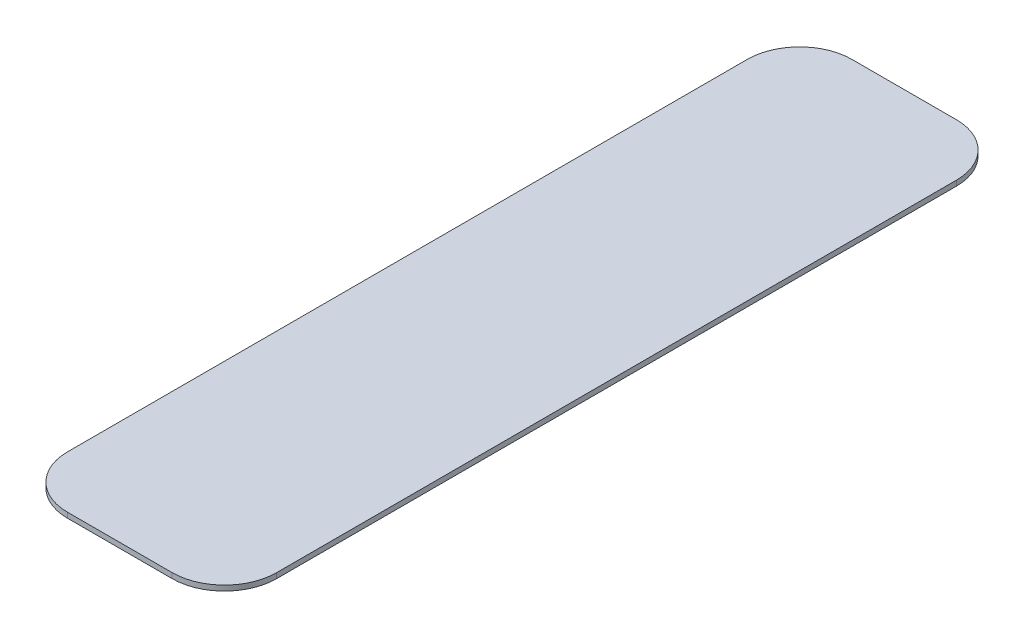
ISO-10303-21;
HEADER;
FILE_DESCRIPTION(('STEP AP214'),'2;1');
FILE_NAME('part.step','',(''),(''),'','','');
FILE_SCHEMA(('AUTOMOTIVE_DESIGN { 1 0 10303 214 1 1 1 1 }'));
ENDSEC;
DATA;
#1=APPLICATION_CONTEXT('core data for automotive mechanical design processes');
#2=APPLICATION_PROTOCOL_DEFINITION('international standard','automotive_design',2000,#1);
#3=PRODUCT_CONTEXT('',#1,'mechanical');
#4=PRODUCT('Part','Part','',(#3));
#5=PRODUCT_RELATED_PRODUCT_CATEGORY('part','',(#4));
#6=PRODUCT_DEFINITION_FORMATION('','',#4);
#7=PRODUCT_DEFINITION_CONTEXT('part definition',#1,'design');
#8=PRODUCT_DEFINITION('design','',#6,#7);
#9=PRODUCT_DEFINITION_SHAPE('','',#8);
#10=(LENGTH_UNIT() NAMED_UNIT(*) SI_UNIT(.MILLI.,.METRE.));
#11=(NAMED_UNIT(*) PLANE_ANGLE_UNIT() SI_UNIT($,.RADIAN.));
#12=(NAMED_UNIT(*) SI_UNIT($,.STERADIAN.) SOLID_ANGLE_UNIT());
#13=UNCERTAINTY_MEASURE_WITH_UNIT(LENGTH_MEASURE(1.E-05),#10,'distance_accuracy_value','');
#14=(GEOMETRIC_REPRESENTATION_CONTEXT(3) GLOBAL_UNCERTAINTY_ASSIGNED_CONTEXT((#13)) GLOBAL_UNIT_ASSIGNED_CONTEXT((#10,
#11,#12)) REPRESENTATION_CONTEXT('',''));
#15=CARTESIAN_POINT('',(0.,0.,0.));
#16=DIRECTION('',(0.,0.,1.));
#17=DIRECTION('',(1.,0.,0.));
#18=AXIS2_PLACEMENT_3D('',#15,#16,#17);
#19=CARTESIAN_POINT('',(-4.00000000000001,0.0999999999999998,15.));
#20=DIRECTION('',(1.,0.,0.));
#21=DIRECTION('',(0.,0.,-1.));
#22=AXIS2_PLACEMENT_3D('',#19,#20,#21);
#23=PLANE('',#22);
#24=DIRECTION('',(0.,0.,-1.));
#25=VECTOR('',#24,1.);
#26=CARTESIAN_POINT('',(-4.00000000000001,0.0999999999999998,15.));
#27=LINE('',#26,#25);
#28=CARTESIAN_POINT('',(-4.00000000000001,0.0999999999999998,13.));
#29=VERTEX_POINT('',#28);
#30=CARTESIAN_POINT('',(-4.00000000000001,0.0999999999999998,-13.));
#31=VERTEX_POINT('',#30);
#32=EDGE_CURVE('E129',#29,#31,#27,.T.);
#33=ORIENTED_EDGE('',*,*,#32,.T.);
#34=DIRECTION('',(0.,-1.,0.));
#35=VECTOR('',#34,1.);
#36=CARTESIAN_POINT('',(-4.00000000000001,0.0999999999999998,-13.));
#37=LINE('',#36,#35);
#38=CARTESIAN_POINT('',(-4.00000000000001,-0.0999999999999998,-13.));
#39=VERTEX_POINT('',#38);
#40=EDGE_CURVE('E168',#31,#39,#37,.T.);
#41=ORIENTED_EDGE('',*,*,#40,.T.);
#42=DIRECTION('',(0.,0.,-1.));
#43=VECTOR('',#42,1.);
#44=CARTESIAN_POINT('',(-4.00000000000001,-0.0999999999999998,15.));
#45=LINE('',#44,#43);
#46=CARTESIAN_POINT('',(-4.00000000000001,-0.0999999999999998,13.));
#47=VERTEX_POINT('',#46);
#48=EDGE_CURVE('E134',#47,#39,#45,.T.);
#49=ORIENTED_EDGE('',*,*,#48,.F.);
#50=DIRECTION('',(0.,-1.,0.));
#51=VECTOR('',#50,1.);
#52=CARTESIAN_POINT('',(-4.00000000000001,0.0999999999999998,13.));
#53=LINE('',#52,#51);
#54=EDGE_CURVE('E165',#47,#29,#53,.F.);
#55=ORIENTED_EDGE('',*,*,#54,.T.);
#56=EDGE_LOOP('',(#33,#41,#49,#55));
#57=FACE_BOUND('',#56,.T.);
#58=ADVANCED_FACE('F38',(#57),#23,.F.);
#59=CARTESIAN_POINT('',(-4.00000000000001,-0.0999999999999998,15.));
#60=DIRECTION('',(0.,1.,0.));
#61=DIRECTION('',(0.,0.,1.));
#62=AXIS2_PLACEMENT_3D('',#59,#60,#61);
#63=PLANE('',#62);
#64=DIRECTION('',(1.,0.,0.));
#65=VECTOR('',#64,1.);
#66=CARTESIAN_POINT('',(-4.00000000000001,-0.0999999999999998,-15.));
#67=LINE('',#66,#65);
#68=CARTESIAN_POINT('',(-2.00000000000001,-0.0999999999999998,-15.));
#69=VERTEX_POINT('',#68);
#70=CARTESIAN_POINT('',(1.99999999999999,-0.0999999999999998,-15.));
#71=VERTEX_POINT('',#70);
#72=EDGE_CURVE('E183',#69,#71,#67,.T.);
#73=ORIENTED_EDGE('',*,*,#72,.T.);
#74=CARTESIAN_POINT('',(1.99999999999999,-0.0999999999999998,-13.));
#75=DIRECTION('',(0.,1.,0.));
#76=DIRECTION('',(0.,0.,1.));
#77=AXIS2_PLACEMENT_3D('',#74,#75,#76);
#78=CIRCLE('',#77,2.);
#79=CARTESIAN_POINT('',(3.99999999999999,-0.0999999999999998,-13.));
#80=VERTEX_POINT('',#79);
#81=EDGE_CURVE('E162',#71,#80,#78,.F.);
#82=ORIENTED_EDGE('',*,*,#81,.T.);
#83=DIRECTION('',(0.,0.,-1.));
#84=VECTOR('',#83,1.);
#85=CARTESIAN_POINT('',(3.99999999999999,-0.0999999999999998,15.));
#86=LINE('',#85,#84);
#87=CARTESIAN_POINT('',(3.99999999999999,-0.0999999999999998,13.));
#88=VERTEX_POINT('',#87);
#89=EDGE_CURVE('E128',#88,#80,#86,.T.);
#90=ORIENTED_EDGE('',*,*,#89,.F.);
#91=CARTESIAN_POINT('',(1.99999999999999,-0.0999999999999998,13.));
#92=DIRECTION('',(0.,1.,0.));
#93=DIRECTION('',(0.,0.,1.));
#94=AXIS2_PLACEMENT_3D('',#91,#92,#93);
#95=CIRCLE('',#94,2.);
#96=CARTESIAN_POINT('',(1.99999999999999,-0.0999999999999998,15.));
#97=VERTEX_POINT('',#96);
#98=EDGE_CURVE('E132',#88,#97,#95,.F.);
#99=ORIENTED_EDGE('',*,*,#98,.T.);
#100=DIRECTION('',(1.,0.,0.));
#101=VECTOR('',#100,1.);
#102=CARTESIAN_POINT('',(-4.00000000000001,-0.0999999999999998,15.));
#103=LINE('',#102,#101);
#104=CARTESIAN_POINT('',(-2.00000000000001,-0.0999999999999998,15.));
#105=VERTEX_POINT('',#104);
#106=EDGE_CURVE('E175',#105,#97,#103,.T.);
#107=ORIENTED_EDGE('',*,*,#106,.F.);
#108=CARTESIAN_POINT('',(-2.00000000000001,-0.0999999999999998,13.));
#109=DIRECTION('',(0.,1.,0.));
#110=DIRECTION('',(0.,0.,1.));
#111=AXIS2_PLACEMENT_3D('',#108,#109,#110);
#112=CIRCLE('',#111,2.);
#113=EDGE_CURVE('E62',#105,#47,#112,.F.);
#114=ORIENTED_EDGE('',*,*,#113,.T.);
#115=ORIENTED_EDGE('',*,*,#48,.T.);
#116=CARTESIAN_POINT('',(-2.00000000000001,-0.0999999999999998,-13.));
#117=DIRECTION('',(0.,1.,0.));
#118=DIRECTION('',(0.,0.,1.));
#119=AXIS2_PLACEMENT_3D('',#116,#117,#118);
#120=CIRCLE('',#119,2.);
#121=EDGE_CURVE('E54',#39,#69,#120,.F.);
#122=ORIENTED_EDGE('',*,*,#121,.T.);
#123=EDGE_LOOP('',(#73,#82,#90,#99,#107,#114,#115,#122));
#124=FACE_BOUND('',#123,.T.);
#125=ADVANCED_FACE('F215',(#124),#63,.F.);
#126=CARTESIAN_POINT('',(3.99999999999999,0.0999999999999998,15.));
#127=DIRECTION('',(-1.,0.,0.));
#128=DIRECTION('',(0.,-1.,0.));
#129=AXIS2_PLACEMENT_3D('',#126,#127,#128);
#130=PLANE('',#129);
#131=ORIENTED_EDGE('',*,*,#89,.T.);
#132=DIRECTION('',(0.,1.,0.));
#133=VECTOR('',#132,1.);
#134=CARTESIAN_POINT('',(3.99999999999999,0.0999999999999998,-13.));
#135=LINE('',#134,#133);
#136=CARTESIAN_POINT('',(3.99999999999999,0.0999999999999998,-13.));
#137=VERTEX_POINT('',#136);
#138=EDGE_CURVE('E118',#80,#137,#135,.T.);
#139=ORIENTED_EDGE('',*,*,#138,.T.);
#140=DIRECTION('',(0.,0.,-1.));
#141=VECTOR('',#140,1.);
#142=CARTESIAN_POINT('',(3.99999999999999,0.0999999999999998,15.));
#143=LINE('',#142,#141);
#144=CARTESIAN_POINT('',(3.99999999999999,0.0999999999999998,13.));
#145=VERTEX_POINT('',#144);
#146=EDGE_CURVE('E109',#145,#137,#143,.T.);
#147=ORIENTED_EDGE('',*,*,#146,.F.);
#148=DIRECTION('',(0.,1.,0.));
#149=VECTOR('',#148,1.);
#150=CARTESIAN_POINT('',(3.99999999999999,-0.0999999999999998,13.));
#151=LINE('',#150,#149);
#152=EDGE_CURVE('E124',#145,#88,#151,.F.);
#153=ORIENTED_EDGE('',*,*,#152,.T.);
#154=EDGE_LOOP('',(#131,#139,#147,#153));
#155=FACE_BOUND('',#154,.T.);
#156=ADVANCED_FACE('F123',(#155),#130,.F.);
#157=CARTESIAN_POINT('',(-4.00000000000001,0.0999999999999998,15.));
#158=DIRECTION('',(0.,-1.,0.));
#159=DIRECTION('',(0.,0.,-1.));
#160=AXIS2_PLACEMENT_3D('',#157,#158,#159);
#161=PLANE('',#160);
#162=ORIENTED_EDGE('',*,*,#146,.T.);
#163=CARTESIAN_POINT('',(1.99999999999999,0.0999999999999998,-13.));
#164=DIRECTION('',(0.,-1.,0.));
#165=DIRECTION('',(0.,0.,-1.));
#166=AXIS2_PLACEMENT_3D('',#163,#164,#165);
#167=CIRCLE('',#166,2.);
#168=CARTESIAN_POINT('',(1.99999999999999,0.0999999999999998,-15.));
#169=VERTEX_POINT('',#168);
#170=EDGE_CURVE('E147',#137,#169,#167,.F.);
#171=ORIENTED_EDGE('',*,*,#170,.T.);
#172=DIRECTION('',(-1.,0.,0.));
#173=VECTOR('',#172,1.);
#174=CARTESIAN_POINT('',(-4.00000000000001,0.0999999999999998,-15.));
#175=LINE('',#174,#173);
#176=CARTESIAN_POINT('',(-2.00000000000001,0.0999999999999998,-15.));
#177=VERTEX_POINT('',#176);
#178=EDGE_CURVE('E177',#169,#177,#175,.T.);
#179=ORIENTED_EDGE('',*,*,#178,.T.);
#180=CARTESIAN_POINT('',(-2.00000000000001,0.0999999999999998,-13.));
#181=DIRECTION('',(0.,-1.,0.));
#182=DIRECTION('',(0.,0.,-1.));
#183=AXIS2_PLACEMENT_3D('',#180,#181,#182);
#184=CIRCLE('',#183,2.);
#185=EDGE_CURVE('E144',#177,#31,#184,.F.);
#186=ORIENTED_EDGE('',*,*,#185,.T.);
#187=ORIENTED_EDGE('',*,*,#32,.F.);
#188=CARTESIAN_POINT('',(-2.00000000000001,0.0999999999999998,13.));
#189=DIRECTION('',(0.,-1.,0.));
#190=DIRECTION('',(0.,0.,-1.));
#191=AXIS2_PLACEMENT_3D('',#188,#189,#190);
#192=CIRCLE('',#191,2.);
#193=CARTESIAN_POINT('',(-2.00000000000001,0.0999999999999998,15.));
#194=VERTEX_POINT('',#193);
#195=EDGE_CURVE('E117',#29,#194,#192,.F.);
#196=ORIENTED_EDGE('',*,*,#195,.T.);
#197=DIRECTION('',(-1.,0.,0.));
#198=VECTOR('',#197,1.);
#199=CARTESIAN_POINT('',(-4.00000000000001,0.0999999999999998,15.));
#200=LINE('',#199,#198);
#201=CARTESIAN_POINT('',(1.99999999999999,0.0999999999999998,15.));
#202=VERTEX_POINT('',#201);
#203=EDGE_CURVE('E111',#202,#194,#200,.T.);
#204=ORIENTED_EDGE('',*,*,#203,.F.);
#205=CARTESIAN_POINT('',(1.99999999999999,0.0999999999999998,13.));
#206=DIRECTION('',(0.,-1.,0.));
#207=DIRECTION('',(0.,0.,-1.));
#208=AXIS2_PLACEMENT_3D('',#205,#206,#207);
#209=CIRCLE('',#208,2.);
#210=EDGE_CURVE('E106',#202,#145,#209,.F.);
#211=ORIENTED_EDGE('',*,*,#210,.T.);
#212=EDGE_LOOP('',(#162,#171,#179,#186,#187,#196,#204,#211));
#213=FACE_BOUND('',#212,.T.);
#214=ADVANCED_FACE('F108',(#213),#161,.F.);
#215=CARTESIAN_POINT('',(0.,0.,15.));
#216=DIRECTION('',(0.,0.,1.));
#217=DIRECTION('',(1.,0.,0.));
#218=AXIS2_PLACEMENT_3D('',#215,#216,#217);
#219=PLANE('',#218);
#220=ORIENTED_EDGE('',*,*,#203,.T.);
#221=DIRECTION('',(0.,-1.,0.));
#222=VECTOR('',#221,1.);
#223=CARTESIAN_POINT('',(-2.00000000000001,-0.0999999999999998,15.));
#224=LINE('',#223,#222);
#225=EDGE_CURVE('E11',#194,#105,#224,.T.);
#226=ORIENTED_EDGE('',*,*,#225,.T.);
#227=ORIENTED_EDGE('',*,*,#106,.T.);
#228=DIRECTION('',(0.,1.,0.));
#229=VECTOR('',#228,1.);
#230=CARTESIAN_POINT('',(1.99999999999999,0.0999999999999912,15.));
#231=LINE('',#230,#229);
#232=EDGE_CURVE('E47',#97,#202,#231,.T.);
#233=ORIENTED_EDGE('',*,*,#232,.T.);
#234=EDGE_LOOP('',(#220,#226,#227,#233));
#235=FACE_BOUND('',#234,.T.);
#236=ADVANCED_FACE('F173',(#235),#219,.T.);
#237=CARTESIAN_POINT('',(0.,0.,-15.));
#238=DIRECTION('',(0.,0.,1.));
#239=DIRECTION('',(1.,0.,0.));
#240=AXIS2_PLACEMENT_3D('',#237,#238,#239);
#241=PLANE('',#240);
#242=ORIENTED_EDGE('',*,*,#178,.F.);
#243=DIRECTION('',(0.,1.,0.));
#244=VECTOR('',#243,1.);
#245=CARTESIAN_POINT('',(1.99999999999999,0.,-15.));
#246=LINE('',#245,#244);
#247=EDGE_CURVE('E153',#169,#71,#246,.F.);
#248=ORIENTED_EDGE('',*,*,#247,.T.);
#249=ORIENTED_EDGE('',*,*,#72,.F.);
#250=DIRECTION('',(0.,-1.,0.));
#251=VECTOR('',#250,1.);
#252=CARTESIAN_POINT('',(-2.00000000000001,0.,-15.));
#253=LINE('',#252,#251);
#254=EDGE_CURVE('E150',#69,#177,#253,.F.);
#255=ORIENTED_EDGE('',*,*,#254,.T.);
#256=EDGE_LOOP('',(#242,#248,#249,#255));
#257=FACE_BOUND('',#256,.T.);
#258=ADVANCED_FACE('F199',(#257),#241,.F.);
#259=CARTESIAN_POINT('',(1.99999999999999,0.0999999999999912,-13.));
#260=DIRECTION('',(0.,1.,0.));
#261=DIRECTION('',(-1.,0.,0.));
#262=AXIS2_PLACEMENT_3D('',#259,#260,#261);
#263=CYLINDRICAL_SURFACE('',#262,2.);
#264=ORIENTED_EDGE('',*,*,#81,.F.);
#265=ORIENTED_EDGE('',*,*,#247,.F.);
#266=ORIENTED_EDGE('',*,*,#170,.F.);
#267=ORIENTED_EDGE('',*,*,#138,.F.);
#268=EDGE_LOOP('',(#264,#265,#266,#267));
#269=FACE_BOUND('',#268,.T.);
#270=ADVANCED_FACE('F194',(#269),#263,.T.);
#271=CARTESIAN_POINT('',(-2.00000000000001,0.0999999999999998,-13.));
#272=DIRECTION('',(0.,-1.,0.));
#273=DIRECTION('',(0.,0.,-1.));
#274=AXIS2_PLACEMENT_3D('',#271,#272,#273);
#275=CYLINDRICAL_SURFACE('',#274,2.);
#276=ORIENTED_EDGE('',*,*,#185,.F.);
#277=ORIENTED_EDGE('',*,*,#254,.F.);
#278=ORIENTED_EDGE('',*,*,#121,.F.);
#279=ORIENTED_EDGE('',*,*,#40,.F.);
#280=EDGE_LOOP('',(#276,#277,#278,#279));
#281=FACE_BOUND('',#280,.T.);
#282=ADVANCED_FACE('F201',(#281),#275,.T.);
#283=CARTESIAN_POINT('',(-2.00000000000001,0.,13.));
#284=DIRECTION('',(0.,1.,0.));
#285=DIRECTION('',(0.,0.,1.));
#286=AXIS2_PLACEMENT_3D('',#283,#284,#285);
#287=CYLINDRICAL_SURFACE('',#286,2.);
#288=ORIENTED_EDGE('',*,*,#195,.F.);
#289=ORIENTED_EDGE('',*,*,#54,.F.);
#290=ORIENTED_EDGE('',*,*,#113,.F.);
#291=ORIENTED_EDGE('',*,*,#225,.F.);
#292=EDGE_LOOP('',(#288,#289,#290,#291));
#293=FACE_BOUND('',#292,.T.);
#294=ADVANCED_FACE('F207',(#293),#287,.T.);
#295=CARTESIAN_POINT('',(1.99999999999999,0.,13.));
#296=DIRECTION('',(0.,-1.,0.));
#297=DIRECTION('',(1.,0.,0.));
#298=AXIS2_PLACEMENT_3D('',#295,#296,#297);
#299=CYLINDRICAL_SURFACE('',#298,2.);
#300=ORIENTED_EDGE('',*,*,#98,.F.);
#301=ORIENTED_EDGE('',*,*,#152,.F.);
#302=ORIENTED_EDGE('',*,*,#210,.F.);
#303=ORIENTED_EDGE('',*,*,#232,.F.);
#304=EDGE_LOOP('',(#300,#301,#302,#303));
#305=FACE_BOUND('',#304,.T.);
#306=ADVANCED_FACE('F40',(#305),#299,.T.);
#307=CLOSED_SHELL('',(#58,#125,#156,#214,#236,#258,#270,#282,#294,#306));
#308=MANIFOLD_SOLID_BREP('B2',#307);
#309=ADVANCED_BREP_SHAPE_REPRESENTATION('',(#18,#308),#14);
#310=SHAPE_DEFINITION_REPRESENTATION(#9,#309);
ENDSEC;
END-ISO-10303-21;
